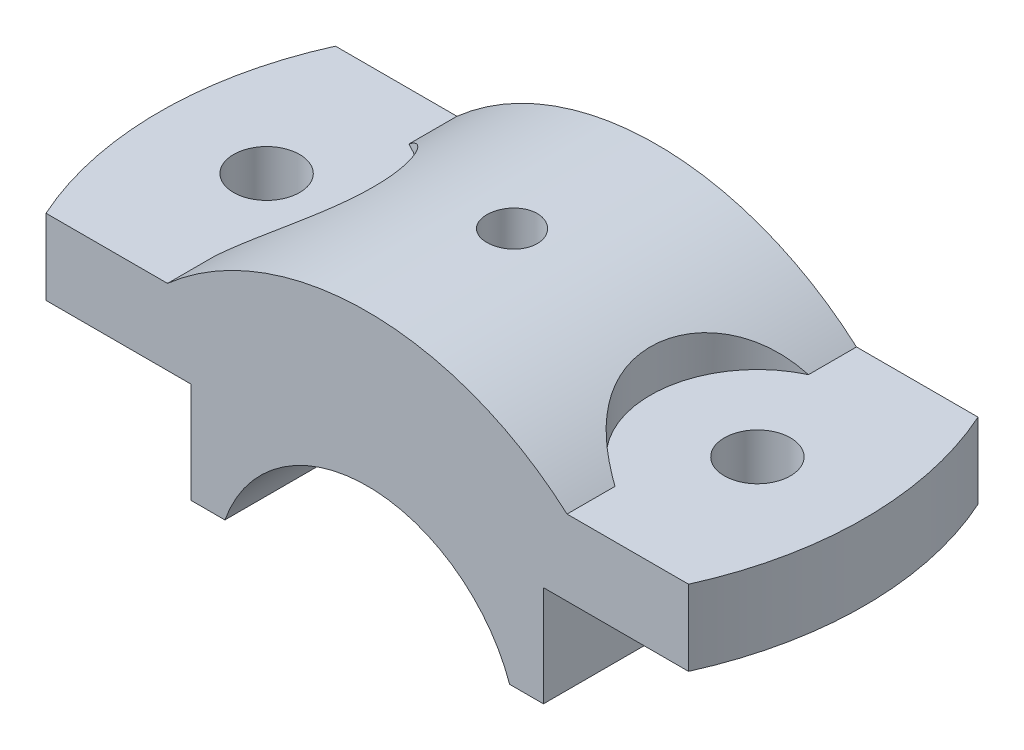
ISO-10303-21;
HEADER;
FILE_DESCRIPTION(('STEP AP214'),'2;1');
FILE_NAME('part.step','',(''),(''),'','','');
FILE_SCHEMA(('AUTOMOTIVE_DESIGN { 1 0 10303 214 1 1 1 1 }'));
ENDSEC;
DATA;
#1=APPLICATION_CONTEXT('core data for automotive mechanical design processes');
#2=APPLICATION_PROTOCOL_DEFINITION('international standard','automotive_design',2000,#1);
#3=PRODUCT_CONTEXT('',#1,'mechanical');
#4=PRODUCT('Part','Part','',(#3));
#5=PRODUCT_RELATED_PRODUCT_CATEGORY('part','',(#4));
#6=PRODUCT_DEFINITION_FORMATION('','',#4);
#7=PRODUCT_DEFINITION_CONTEXT('part definition',#1,'design');
#8=PRODUCT_DEFINITION('design','',#6,#7);
#9=PRODUCT_DEFINITION_SHAPE('','',#8);
#10=(LENGTH_UNIT() NAMED_UNIT(*) SI_UNIT(.MILLI.,.METRE.));
#11=(NAMED_UNIT(*) PLANE_ANGLE_UNIT() SI_UNIT($,.RADIAN.));
#12=(NAMED_UNIT(*) SI_UNIT($,.STERADIAN.) SOLID_ANGLE_UNIT());
#13=UNCERTAINTY_MEASURE_WITH_UNIT(LENGTH_MEASURE(1.E-05),#10,'distance_accuracy_value','');
#14=(GEOMETRIC_REPRESENTATION_CONTEXT(3) GLOBAL_UNCERTAINTY_ASSIGNED_CONTEXT((#13)) GLOBAL_UNIT_ASSIGNED_CONTEXT((#10,
#11,#12)) REPRESENTATION_CONTEXT('',''));
#15=CARTESIAN_POINT('',(0.,0.,0.));
#16=DIRECTION('',(0.,0.,1.));
#17=DIRECTION('',(1.,0.,0.));
#18=AXIS2_PLACEMENT_3D('',#15,#16,#17);
#19=CARTESIAN_POINT('',(0.,-24.,23.));
#20=DIRECTION('',(0.,0.,-1.));
#21=DIRECTION('',(-1.,0.,0.));
#22=AXIS2_PLACEMENT_3D('',#19,#20,#21);
#23=CYLINDRICAL_SURFACE('',#22,48.);
#24=CARTESIAN_POINT('',(0.,24.,-4.));
#25=CARTESIAN_POINT('',(0.224264359684817,23.9999978164606,-3.99999020469488));
#26=CARTESIAN_POINT('',(0.448681388720902,23.9984115417359,-3.98107612075582));
#27=CARTESIAN_POINT('',(0.891306282801559,23.99223609313,-3.90590259257969));
#28=CARTESIAN_POINT('',(1.10950682090092,23.9876435172678,-3.84960083878039));
#29=CARTESIAN_POINT('',(1.53322409005704,23.9759744498441,-3.70129138476253));
#30=CARTESIAN_POINT('',(1.73874792169846,23.9688993639394,-3.60930388756073));
#31=CARTESIAN_POINT('',(2.1313889336643,23.9530587097885,-3.39227027251202));
#32=CARTESIAN_POINT('',(2.31851003954155,23.9442935032543,-3.26723122608997));
#33=CARTESIAN_POINT('',(2.66955999986236,23.9260311946685,-2.98729973357602));
#34=CARTESIAN_POINT('',(2.83343548966464,23.9165324834631,-2.83234046425726));
#35=CARTESIAN_POINT('',(3.13288453414622,23.8978872321267,-2.49710841660027));
#36=CARTESIAN_POINT('',(3.26845684548602,23.8887407074816,-2.31683452678951));
#37=CARTESIAN_POINT('',(3.50763168956092,23.8718181064497,-1.93576753160389));
#38=CARTESIAN_POINT('',(3.61118733180617,23.8640440472037,-1.73494489838891));
#39=CARTESIAN_POINT('',(3.78308973509538,23.8507649779309,-1.31868681777607));
#40=CARTESIAN_POINT('',(3.85143711804967,23.8452599278253,-1.103251628567));
#41=CARTESIAN_POINT('',(3.95082811927428,23.8371556826529,-0.664418432475291));
#42=CARTESIAN_POINT('',(3.9819586615591,23.8345497174488,-0.441040240029593));
#43=CARTESIAN_POINT('',(4.00630083206171,23.832517292859,0.00778481578146177));
#44=CARTESIAN_POINT('',(3.99951317191816,23.8330907738024,0.23323164024401));
#45=CARTESIAN_POINT('',(3.94828345685939,23.8373462944655,0.679198662042084));
#46=CARTESIAN_POINT('',(3.90393587215223,23.8410205351141,0.899729796305649));
#47=CARTESIAN_POINT('',(3.77899194153176,23.8510513427746,1.33020746957181));
#48=CARTESIAN_POINT('',(3.69839524158714,23.857407935984,1.54015390517541));
#49=CARTESIAN_POINT('',(3.50313515260813,23.8720961882741,1.94380362351239));
#50=CARTESIAN_POINT('',(3.38842937902877,23.8804303020385,2.13748631035003));
#51=CARTESIAN_POINT('',(3.12823777565339,23.8981322745552,2.50288535527922));
#52=CARTESIAN_POINT('',(2.98275132249017,23.9075001542413,2.67460126838886));
#53=CARTESIAN_POINT('',(2.66459832890545,23.9262488164658,2.99174167712626));
#54=CARTESIAN_POINT('',(2.4918501175623,23.9356295510026,3.13708425651701));
#55=CARTESIAN_POINT('',(2.124362225487,23.9533196747934,3.39671889355421));
#56=CARTESIAN_POINT('',(1.92962253006135,23.9616290633314,3.51101093045423));
#57=CARTESIAN_POINT('',(1.52362637307141,23.9762418323856,3.70529505067482));
#58=CARTESIAN_POINT('',(1.3123681672363,23.9825450006977,3.78528350591262));
#59=CARTESIAN_POINT('',(0.879356276078329,23.9924326964719,3.90863252980531));
#60=CARTESIAN_POINT('',(0.657602808675422,23.9960172803554,3.95199385862105));
#61=CARTESIAN_POINT('',(0.210605200657006,24.000056677722,4.00075505616631));
#62=CARTESIAN_POINT('',(-0.0146265164607818,24.0005208196801,4.00626807242759));
#63=CARTESIAN_POINT('',(-0.462811010013211,23.998291951148,3.97947255749074));
#64=CARTESIAN_POINT('',(-0.685763807685651,23.995598970107,3.94716437908216));
#65=CARTESIAN_POINT('',(-1.1227390248988,23.9873647136528,3.84573736555962));
#66=CARTESIAN_POINT('',(-1.33677370055889,23.9818274966968,3.77667097589676));
#67=CARTESIAN_POINT('',(-1.75021666032995,23.968526804494,3.60374164887189));
#68=CARTESIAN_POINT('',(-1.94962471313253,23.9607632940497,3.499878161366));
#69=CARTESIAN_POINT('',(-2.32866887320763,23.9438570557453,3.26001860313458));
#70=CARTESIAN_POINT('',(-2.50825740208588,23.9347111287495,3.12394757442069));
#71=CARTESIAN_POINT('',(-2.84208437937448,23.9160783455879,2.82364377179807));
#72=CARTESIAN_POINT('',(-2.99632238725753,23.9065914835011,2.65941050860293));
#73=CARTESIAN_POINT('',(-3.27545818182041,23.8883184486329,2.30695323120664));
#74=CARTESIAN_POINT('',(-3.40028213293455,23.8795340749689,2.1186706352104));
#75=CARTESIAN_POINT('',(-3.61654025135807,23.8636860697728,1.72375094854634));
#76=CARTESIAN_POINT('',(-3.70797475203985,23.8566224210606,1.51711404116025));
#77=CARTESIAN_POINT('',(-3.85473270976226,23.8450257139576,1.09161283784305));
#78=CARTESIAN_POINT('',(-3.91010136579716,23.8404894891454,0.87276422114268));
#79=CARTESIAN_POINT('',(-3.98330307964061,23.834450627634,0.428837200502306));
#80=CARTESIAN_POINT('',(-4.00113685827306,23.8329479326787,0.203758916281624));
#81=CARTESIAN_POINT('',(-3.99875425156372,23.8331471180078,-0.24550450408358));
#82=CARTESIAN_POINT('',(-3.97865387910956,23.8348392277228,-0.469690268945749));
#83=CARTESIAN_POINT('',(-3.90121545318012,23.8412166032923,-0.911490134203402));
#84=CARTESIAN_POINT('',(-3.84387734291051,23.8459018737118,-1.12910422457536));
#85=CARTESIAN_POINT('',(-3.69362044006825,23.8577350852682,-1.55159105306647));
#86=CARTESIAN_POINT('',(-3.60070373602613,23.8648828818476,-1.75646453826275));
#87=CARTESIAN_POINT('',(-3.381940235789,23.8808359950028,-2.14772336229467));
#88=CARTESIAN_POINT('',(-3.25609395645823,23.8896412855619,-2.3341089912533));
#89=CARTESIAN_POINT('',(-2.97460776848979,23.9079492679473,-2.68369495605204));
#90=CARTESIAN_POINT('',(-2.81888197496584,23.9174539202297,-2.84682603462939));
#91=CARTESIAN_POINT('',(-2.48221290236986,23.9360718003871,-3.14470074081327));
#92=CARTESIAN_POINT('',(-2.30126353056437,23.945184932993,-3.27943748998406));
#93=CARTESIAN_POINT('',(-1.91893509211766,23.962009393691,-3.51687944167025));
#94=CARTESIAN_POINT('',(-1.71751862508215,23.9697180809242,-3.61952455462531));
#95=CARTESIAN_POINT('',(-1.30038300798293,23.982834100652,-3.78940721220511));
#96=CARTESIAN_POINT('',(-1.0846806216546,23.9882440771303,-3.85668545715242));
#97=CARTESIAN_POINT('',(-0.723088192386718,23.994764309354,-3.93679033000819));
#98=CARTESIAN_POINT('',(-0.579523577753883,23.9967187550781,-3.96046245006995));
#99=CARTESIAN_POINT('',(-0.29066068600465,23.9993373063453,-3.99207043870882));
#100=CARTESIAN_POINT('',(-0.14536241349218,24.0000014153143,-4.00000634906587));
#101=CARTESIAN_POINT('',(0.,24.,-4.));
#102=B_SPLINE_CURVE_WITH_KNOTS('',3,(#24,#25,#26,#27,#28,#29,#30,#31,#32,#33,#34,#35,#36,#37,
#38,#39,#40,#41,#42,#43,#44,#45,#46,#47,#48,#49,#50,#51,#52,#53,#54,#55,#56,#57,#58,#59,#60,#61,
#62,#63,#64,#65,#66,#67,#68,#69,#70,#71,#72,#73,#74,#75,#76,#77,#78,#79,#80,#81,#82,#83,#84,#85,
#86,#87,#88,#89,#90,#91,#92,#93,#94,#95,#96,#97,#98,#99,#100,#101),.UNSPECIFIED.,.T.,.F.,(4,2,2,
2,2,2,2,2,2,2,2,2,2,2,2,2,2,2,2,2,2,2,2,2,2,2,2,2,2,2,2,2,2,2,2,2,2,2,4),(0.,0.672262347200556,
1.34528675599134,2.01793069555582,2.69043083833672,3.36445067514306,4.03850011495726,
4.71353211804365,5.38855219711603,6.06199259326345,6.73542035050475,7.40715932441158,
8.07890485907995,8.75148862995597,9.4240860232344,10.098738037406,10.7733905023458,
11.448114303618,12.1228241013014,12.7955159722867,13.4682015685688,14.1399299612314,
14.8116689744549,15.4849869989971,16.15831672285,16.8333190596481,17.5083146567931,
18.1824626896371,18.8565977759503,19.5286745153011,20.2007522796936,20.8727905979009,
21.5448183683942,22.2188075465856,22.8929598092992,23.5683669225021,24.2429950636714,
24.6787394542665,25.1144826879498),.UNSPECIFIED.);
#103=CARTESIAN_POINT('',(0.,24.,-4.));
#104=VERTEX_POINT('',#103);
#105=EDGE_CURVE('E12',#104,#104,#102,.T.);
#106=ORIENTED_EDGE('',*,*,#105,.T.);
#107=EDGE_LOOP('',(#106));
#108=FACE_BOUND('',#107,.T.);
#109=CARTESIAN_POINT('',(31.7490157327751,12.,-15.3760601961769));
#110=CARTESIAN_POINT('',(31.5666993606048,12.1607910344816,-15.2900831270757));
#111=CARTESIAN_POINT('',(31.3842407385664,12.3192382806886,-15.200076432177));
#112=CARTESIAN_POINT('',(31.0194382984914,12.6312986785064,-15.0117552307289));
#113=CARTESIAN_POINT('',(30.83709449581,12.7849112802083,-14.9134397837671));
#114=CARTESIAN_POINT('',(30.2906545114744,13.2384242405059,-14.6055515958542));
#115=CARTESIAN_POINT('',(29.9273932433292,13.5307855559239,-14.3831506648985));
#116=CARTESIAN_POINT('',(29.2055877678829,14.0952057641667,-13.9017498917579));
#117=CARTESIAN_POINT('',(28.8470773519232,14.3671527207169,-13.6425680163447));
#118=CARTESIAN_POINT('',(28.1414563178619,14.8876660950044,-13.0879067788259));
#119=CARTESIAN_POINT('',(27.7943424142725,15.1362392903486,-12.7924379963692));
#120=CARTESIAN_POINT('',(27.1144372728569,15.6103537782901,-12.1634340928703));
#121=CARTESIAN_POINT('',(26.7817440960143,15.8357484531289,-11.8296819039897));
#122=CARTESIAN_POINT('',(26.1381758530123,16.2609560521935,-11.1265718110928));
#123=CARTESIAN_POINT('',(25.8273031949563,16.4607661549158,-10.7572099878546));
#124=CARTESIAN_POINT('',(25.2335249148575,16.8337098769773,-9.98600624775));
#125=CARTESIAN_POINT('',(24.9505424988563,17.0069175240426,-9.58425938846312));
#126=CARTESIAN_POINT('',(24.4165226257608,17.3271148139075,-8.7502719786338));
#127=CARTESIAN_POINT('',(24.165480267083,17.4741084809499,-8.31803612285602));
#128=CARTESIAN_POINT('',(23.7269538102758,17.7263466257883,-7.4787321432782));
#129=CARTESIAN_POINT('',(23.535471816767,17.8344606926746,-7.07460691096142));
#130=CARTESIAN_POINT('',(23.1835604410674,18.0305023424913,-6.24834535649117));
#131=CARTESIAN_POINT('',(23.0231288276401,18.1184313759742,-5.82621033115844));
#132=CARTESIAN_POINT('',(22.7354708993115,18.2744033380662,-4.96694066927119));
#133=CARTESIAN_POINT('',(22.608263014144,18.3424352319097,-4.52979785912656));
#134=CARTESIAN_POINT('',(22.3889311500727,18.4588178093571,-3.64423461983451));
#135=CARTESIAN_POINT('',(22.2968060905276,18.5071690991774,-3.19581453850972));
#136=CARTESIAN_POINT('',(22.1535573681311,18.5819913104556,-2.31986442510464));
#137=CARTESIAN_POINT('',(22.1002179585565,18.6096478774008,-1.8927960452594));
#138=CARTESIAN_POINT('',(22.0260840023336,18.6480173220226,-1.03510100849079));
#139=CARTESIAN_POINT('',(22.0052877863416,18.6587310688026,-0.6044745352235));
#140=CARTESIAN_POINT('',(21.9964874817101,18.6632694542849,0.25703375198857));
#141=CARTESIAN_POINT('',(22.0084707600267,18.6571005994522,0.68791540359773));
#142=CARTESIAN_POINT('',(22.065059537599,18.6278566152432,1.5469567479689));
#143=CARTESIAN_POINT('',(22.1096651361626,18.6047814344012,1.97511643244078));
#144=CARTESIAN_POINT('',(22.2301596888934,18.5420325739506,2.81994764060092));
#145=CARTESIAN_POINT('',(22.3056259308811,18.5025830752487,3.23669621522389));
#146=CARTESIAN_POINT('',(22.4869158657054,18.4069464217796,4.06157204983066));
#147=CARTESIAN_POINT('',(22.5927390819871,18.3507595297616,4.46969944504494));
#148=CARTESIAN_POINT('',(22.8334963082055,18.2214412118201,5.27452238868222));
#149=CARTESIAN_POINT('',(22.968430619134,18.1483096106976,5.67121781885727));
#150=CARTESIAN_POINT('',(23.2658059297839,17.9848905587104,6.45050946606149));
#151=CARTESIAN_POINT('',(23.4282471429062,17.8946029747475,6.83310557367884));
#152=CARTESIAN_POINT('',(23.7802108235912,17.6958360657888,7.58497168737197));
#153=CARTESIAN_POINT('',(23.9699550727257,17.5872063549857,7.9540980563005));
#154=CARTESIAN_POINT('',(24.3731485080022,17.3521952355227,8.67324372694056));
#155=CARTESIAN_POINT('',(24.5865977528721,17.2258137828835,9.02326298131199));
#156=CARTESIAN_POINT('',(25.0346129932482,16.9552998874379,9.70223622389593));
#157=CARTESIAN_POINT('',(25.2691774101921,16.8111687712936,10.031191783681));
#158=CARTESIAN_POINT('',(25.7566603032743,16.5052741270816,10.6665029899036));
#159=CARTESIAN_POINT('',(26.0095789285025,16.3435104557808,10.9728584527217));
#160=CARTESIAN_POINT('',(26.5418842805158,15.9954208539865,11.574253346598));
#161=CARTESIAN_POINT('',(26.8219376643438,15.8083462352715,11.8682688661706));
#162=CARTESIAN_POINT('',(27.3955194624364,15.4158125971757,12.42968690155));
#163=CARTESIAN_POINT('',(27.6890490642933,15.2103519560056,12.6970870652738));
#164=CARTESIAN_POINT('',(28.2863824379904,14.7816416595243,13.2050051767951));
#165=CARTESIAN_POINT('',(28.5901897214681,14.5583858879776,13.4455138130625));
#166=CARTESIAN_POINT('',(29.2047776474053,14.0950011657592,13.8996257253554));
#167=CARTESIAN_POINT('',(29.515556781803,13.8548758405909,14.113234755093));
#168=CARTESIAN_POINT('',(30.1465409740783,13.3543930550497,14.5175420543304));
#169=CARTESIAN_POINT('',(30.4668164417767,13.0937608790559,14.7077886938376));
#170=CARTESIAN_POINT('',(31.1079315091614,12.5577863535064,15.0615091701432));
#171=CARTESIAN_POINT('',(31.4287665224091,12.282490555825,15.2250617322872));
#172=CARTESIAN_POINT('',(31.7490157327751,12.,15.3760601961769));
#173=B_SPLINE_CURVE_WITH_KNOTS('',3,(#109,#110,#111,#112,#113,#114,#115,#116,#117,#118,#119,
#120,#121,#122,#123,#124,#125,#126,#127,#128,#129,#130,#131,#132,#133,#134,#135,#136,#137,#138,
#139,#140,#141,#142,#143,#144,#145,#146,#147,#148,#149,#150,#151,#152,#153,#154,#155,#156,#157,
#158,#159,#160,#161,#162,#163,#164,#165,#166,#167,#168,#169,#170,#171,#172),.UNSPECIFIED.,.F.,
.F.,(4,2,2,2,2,2,2,2,2,2,2,2,2,2,2,2,2,2,2,2,2,2,2,2,2,2,2,2,2,2,2,4),(0.,0.77345802568237,
1.54700371148749,3.09512332277502,4.65119082007948,6.20680570955183,7.77172305062614,
9.33681282467528,10.8974652129592,12.4578778108564,13.8363264835486,15.2146760660573,
16.5937886249588,17.9728587002062,19.2651269606079,20.5573289303254,21.8490329624022,
23.1407409266611,24.4153187748838,25.6898766154092,26.9644476347566,28.2390285427914,
29.5246179289053,30.8102105000725,32.0957070405173,33.381214024115,34.7209972321288,
36.060898736084,37.4012627703214,38.7413396176214,40.1042161588979,41.4629977344695),.UNSPECIFIED.);
#174=CARTESIAN_POINT('',(31.7490157327751,12.,-15.3760601961769));
#175=VERTEX_POINT('',#174);
#176=CARTESIAN_POINT('',(31.7490157327751,12.,15.3760601961769));
#177=VERTEX_POINT('',#176);
#178=EDGE_CURVE('E57',#175,#177,#173,.T.);
#179=ORIENTED_EDGE('',*,*,#178,.F.);
#180=DIRECTION('',(0.,0.,-1.));
#181=VECTOR('',#180,1.);
#182=CARTESIAN_POINT('',(31.7490157327751,12.,23.));
#183=LINE('',#182,#181);
#184=CARTESIAN_POINT('',(31.7490157327751,12.,-23.));
#185=VERTEX_POINT('',#184);
#186=EDGE_CURVE('E156',#175,#185,#183,.T.);
#187=ORIENTED_EDGE('',*,*,#186,.T.);
#188=CARTESIAN_POINT('',(0.,-24.,-23.));
#189=DIRECTION('',(0.,0.,1.));
#190=DIRECTION('',(1.,0.,0.));
#191=AXIS2_PLACEMENT_3D('',#188,#189,#190);
#192=CIRCLE('',#191,48.);
#193=CARTESIAN_POINT('',(-31.7490157327751,12.,-23.));
#194=VERTEX_POINT('',#193);
#195=EDGE_CURVE('E322',#185,#194,#192,.T.);
#196=ORIENTED_EDGE('',*,*,#195,.T.);
#197=DIRECTION('',(0.,0.,-1.));
#198=VECTOR('',#197,1.);
#199=CARTESIAN_POINT('',(-31.7490157327751,12.,23.));
#200=LINE('',#199,#198);
#201=CARTESIAN_POINT('',(-31.7490157327751,12.,-15.3760601961769));
#202=VERTEX_POINT('',#201);
#203=EDGE_CURVE('E169',#202,#194,#200,.T.);
#204=ORIENTED_EDGE('',*,*,#203,.F.);
#205=CARTESIAN_POINT('',(-31.7490157327751,12.,15.3760601961769));
#206=CARTESIAN_POINT('',(-31.5666993606048,12.1607910344816,15.2900831270757));
#207=CARTESIAN_POINT('',(-31.3842407385664,12.3192382806886,15.200076432177));
#208=CARTESIAN_POINT('',(-31.0194382984914,12.6312986785064,15.0117552307289));
#209=CARTESIAN_POINT('',(-30.83709449581,12.7849112802083,14.9134397837671));
#210=CARTESIAN_POINT('',(-30.2906545114744,13.2384242405059,14.6055515958542));
#211=CARTESIAN_POINT('',(-29.9273932433292,13.5307855559239,14.3831506648985));
#212=CARTESIAN_POINT('',(-29.2055877678829,14.0952057641667,13.9017498917579));
#213=CARTESIAN_POINT('',(-28.8470773519232,14.3671527207169,13.6425680163447));
#214=CARTESIAN_POINT('',(-28.1414563178619,14.8876660950044,13.087906778826));
#215=CARTESIAN_POINT('',(-27.7943424142725,15.1362392903486,12.7924379963692));
#216=CARTESIAN_POINT('',(-27.1144372728569,15.6103537782901,12.1634340928703));
#217=CARTESIAN_POINT('',(-26.7817440960143,15.8357484531289,11.8296819039897));
#218=CARTESIAN_POINT('',(-26.1381758530123,16.2609560521935,11.1265718110928));
#219=CARTESIAN_POINT('',(-25.8273031949563,16.4607661549158,10.7572099878546));
#220=CARTESIAN_POINT('',(-25.2335249148575,16.8337098769773,9.98600624775));
#221=CARTESIAN_POINT('',(-24.9505424988563,17.0069175240426,9.58425938846312));
#222=CARTESIAN_POINT('',(-24.4165226257608,17.3271148139075,8.7502719786338));
#223=CARTESIAN_POINT('',(-24.165480267083,17.4741084809499,8.31803612285601));
#224=CARTESIAN_POINT('',(-23.7269538102758,17.7263466257883,7.4787321432782));
#225=CARTESIAN_POINT('',(-23.535471816767,17.8344606926746,7.07460691096142));
#226=CARTESIAN_POINT('',(-23.1835604410674,18.0305023424913,6.24834535649116));
#227=CARTESIAN_POINT('',(-23.02312882764,18.1184313759742,5.82621033115843));
#228=CARTESIAN_POINT('',(-22.7354708993115,18.2744033380662,4.96694066927118));
#229=CARTESIAN_POINT('',(-22.608263014144,18.3424352319097,4.52979785912655));
#230=CARTESIAN_POINT('',(-22.3889311500727,18.4588178093571,3.6442346198345));
#231=CARTESIAN_POINT('',(-22.2968060905276,18.5071690991774,3.19581453850971));
#232=CARTESIAN_POINT('',(-22.1535573681311,18.5819913104556,2.31986442510463));
#233=CARTESIAN_POINT('',(-22.1002179585565,18.6096478774008,1.89279604525939));
#234=CARTESIAN_POINT('',(-22.0260840023336,18.6480173220226,1.03510100849079));
#235=CARTESIAN_POINT('',(-22.0052877863416,18.6587310688026,0.604474535223495));
#236=CARTESIAN_POINT('',(-21.9964874817101,18.6632694542849,-0.257033751988574));
#237=CARTESIAN_POINT('',(-22.0084707600267,18.6571005994522,-0.687915403597735));
#238=CARTESIAN_POINT('',(-22.065059537599,18.6278566152432,-1.54695674796891));
#239=CARTESIAN_POINT('',(-22.1096651361626,18.6047814344012,-1.97511643244079));
#240=CARTESIAN_POINT('',(-22.2301596888934,18.5420325739506,-2.81994764060092));
#241=CARTESIAN_POINT('',(-22.3056259308811,18.5025830752487,-3.2366962152239));
#242=CARTESIAN_POINT('',(-22.4869158657054,18.4069464217796,-4.06157204983067));
#243=CARTESIAN_POINT('',(-22.5927390819871,18.3507595297616,-4.46969944504494));
#244=CARTESIAN_POINT('',(-22.8334963082055,18.2214412118201,-5.27452238868223));
#245=CARTESIAN_POINT('',(-22.968430619134,18.1483096106976,-5.67121781885727));
#246=CARTESIAN_POINT('',(-23.2658059297839,17.9848905587104,-6.45050946606149));
#247=CARTESIAN_POINT('',(-23.4282471429062,17.8946029747475,-6.83310557367884));
#248=CARTESIAN_POINT('',(-23.7802108235912,17.6958360657888,-7.58497168737197));
#249=CARTESIAN_POINT('',(-23.9699550727257,17.5872063549857,-7.9540980563005));
#250=CARTESIAN_POINT('',(-24.3731485080022,17.3521952355227,-8.67324372694056));
#251=CARTESIAN_POINT('',(-24.5865977528721,17.2258137828835,-9.02326298131199));
#252=CARTESIAN_POINT('',(-25.0346129932482,16.9552998874379,-9.70223622389594));
#253=CARTESIAN_POINT('',(-25.2691774101921,16.8111687712936,-10.031191783681));
#254=CARTESIAN_POINT('',(-25.7566603032743,16.5052741270816,-10.6665029899036));
#255=CARTESIAN_POINT('',(-26.0095789285025,16.3435104557808,-10.9728584527218));
#256=CARTESIAN_POINT('',(-26.5418842805158,15.9954208539865,-11.574253346598));
#257=CARTESIAN_POINT('',(-26.8219376643438,15.8083462352715,-11.8682688661706));
#258=CARTESIAN_POINT('',(-27.3955194624364,15.4158125971757,-12.42968690155));
#259=CARTESIAN_POINT('',(-27.6890490642933,15.2103519560056,-12.6970870652738));
#260=CARTESIAN_POINT('',(-28.2863824379904,14.7816416595243,-13.2050051767951));
#261=CARTESIAN_POINT('',(-28.5901897214681,14.5583858879776,-13.4455138130625));
#262=CARTESIAN_POINT('',(-29.2047776474053,14.0950011657592,-13.8996257253554));
#263=CARTESIAN_POINT('',(-29.515556781803,13.8548758405909,-14.113234755093));
#264=CARTESIAN_POINT('',(-30.1465409740783,13.3543930550497,-14.5175420543304));
#265=CARTESIAN_POINT('',(-30.4668164417767,13.0937608790559,-14.7077886938376));
#266=CARTESIAN_POINT('',(-31.1079315091614,12.5577863535064,-15.0615091701432));
#267=CARTESIAN_POINT('',(-31.4287665224091,12.282490555825,-15.2250617322872));
#268=CARTESIAN_POINT('',(-31.7490157327751,12.,-15.3760601961769));
#269=B_SPLINE_CURVE_WITH_KNOTS('',3,(#205,#206,#207,#208,#209,#210,#211,#212,#213,#214,#215,
#216,#217,#218,#219,#220,#221,#222,#223,#224,#225,#226,#227,#228,#229,#230,#231,#232,#233,#234,
#235,#236,#237,#238,#239,#240,#241,#242,#243,#244,#245,#246,#247,#248,#249,#250,#251,#252,#253,
#254,#255,#256,#257,#258,#259,#260,#261,#262,#263,#264,#265,#266,#267,#268),.UNSPECIFIED.,.F.,
.F.,(4,2,2,2,2,2,2,2,2,2,2,2,2,2,2,2,2,2,2,2,2,2,2,2,2,2,2,2,2,2,2,4),(0.,0.773458025682373,
1.5470037114875,3.09512332277503,4.65119082007948,6.20680570955184,7.77172305062615,
9.33681282467528,10.8974652129592,12.4578778108564,13.8363264835486,15.2146760660573,
16.5937886249588,17.9728587002062,19.2651269606079,20.5573289303254,21.8490329624022,
23.1407409266611,24.4153187748838,25.6898766154092,26.9644476347566,28.2390285427914,
29.5246179289053,30.8102105000725,32.0957070405173,33.381214024115,34.7209972321288,
36.060898736084,37.4012627703214,38.7413396176214,40.1042161588979,41.4629977344695),.UNSPECIFIED.);
#270=CARTESIAN_POINT('',(-31.7490157327751,12.,15.3760601961769));
#271=VERTEX_POINT('',#270);
#272=EDGE_CURVE('E160',#271,#202,#269,.T.);
#273=ORIENTED_EDGE('',*,*,#272,.F.);
#274=CARTESIAN_POINT('',(-31.7490157327751,12.,23.));
#275=VERTEX_POINT('',#274);
#276=EDGE_CURVE('E166',#275,#271,#200,.T.);
#277=ORIENTED_EDGE('',*,*,#276,.F.);
#278=CARTESIAN_POINT('',(0.,-24.,23.));
#279=DIRECTION('',(0.,0.,1.));
#280=DIRECTION('',(1.,0.,0.));
#281=AXIS2_PLACEMENT_3D('',#278,#279,#280);
#282=CIRCLE('',#281,48.);
#283=CARTESIAN_POINT('',(31.7490157327751,12.,23.));
#284=VERTEX_POINT('',#283);
#285=EDGE_CURVE('E296',#284,#275,#282,.T.);
#286=ORIENTED_EDGE('',*,*,#285,.F.);
#287=EDGE_CURVE('E159',#284,#177,#183,.T.);
#288=ORIENTED_EDGE('',*,*,#287,.T.);
#289=EDGE_LOOP('',(#179,#187,#196,#204,#273,#277,#286,#288));
#290=FACE_BOUND('',#289,.T.);
#291=ADVANCED_FACE('F44',(#108,#290),#23,.T.);
#292=CARTESIAN_POINT('',(28.,0.,23.));
#293=DIRECTION('',(0.,1.,0.));
#294=DIRECTION('',(0.,0.,1.));
#295=AXIS2_PLACEMENT_3D('',#292,#293,#294);
#296=PLANE('',#295);
#297=CARTESIAN_POINT('',(39.,0.,0.));
#298=DIRECTION('',(0.,1.,0.));
#299=DIRECTION('',(0.,0.,1.));
#300=AXIS2_PLACEMENT_3D('',#297,#298,#299);
#301=CIRCLE('',#300,5.25);
#302=CARTESIAN_POINT('',(39.,0.,5.25));
#303=VERTEX_POINT('',#302);
#304=EDGE_CURVE('E274',#303,#303,#301,.T.);
#305=ORIENTED_EDGE('',*,*,#304,.T.);
#306=EDGE_LOOP('',(#305));
#307=FACE_BOUND('',#306,.T.);
#308=CARTESIAN_POINT('',(0.,0.,0.));
#309=DIRECTION('',(0.,1.,0.));
#310=DIRECTION('',(0.,0.,1.));
#311=AXIS2_PLACEMENT_3D('',#308,#309,#310);
#312=CIRCLE('',#311,56.);
#313=CARTESIAN_POINT('',(51.058789644879,0.,23.));
#314=VERTEX_POINT('',#313);
#315=CARTESIAN_POINT('',(51.058789644879,0.,-23.));
#316=VERTEX_POINT('',#315);
#317=EDGE_CURVE('E278',#314,#316,#312,.T.);
#318=ORIENTED_EDGE('',*,*,#317,.F.);
#319=DIRECTION('',(1.,0.,0.));
#320=VECTOR('',#319,1.);
#321=CARTESIAN_POINT('',(28.,0.,23.));
#322=LINE('',#321,#320);
#323=CARTESIAN_POINT('',(28.,0.,23.));
#324=VERTEX_POINT('',#323);
#325=EDGE_CURVE('E281',#324,#314,#322,.T.);
#326=ORIENTED_EDGE('',*,*,#325,.F.);
#327=DIRECTION('',(0.,0.,-1.));
#328=VECTOR('',#327,1.);
#329=CARTESIAN_POINT('',(28.,0.,23.));
#330=LINE('',#329,#328);
#331=CARTESIAN_POINT('',(28.,0.,-23.));
#332=VERTEX_POINT('',#331);
#333=EDGE_CURVE('E319',#324,#332,#330,.T.);
#334=ORIENTED_EDGE('',*,*,#333,.T.);
#335=DIRECTION('',(1.,0.,0.));
#336=VECTOR('',#335,1.);
#337=CARTESIAN_POINT('',(28.,0.,-23.));
#338=LINE('',#337,#336);
#339=EDGE_CURVE('E283',#332,#316,#338,.T.);
#340=ORIENTED_EDGE('',*,*,#339,.T.);
#341=EDGE_LOOP('',(#318,#326,#334,#340));
#342=FACE_BOUND('',#341,.T.);
#343=ADVANCED_FACE('F46',(#307,#342),#296,.F.);
#344=CARTESIAN_POINT('',(56.,12.,23.));
#345=DIRECTION('',(0.,-1.,0.));
#346=DIRECTION('',(1.,0.,0.));
#347=AXIS2_PLACEMENT_3D('',#344,#345,#346);
#348=PLANE('',#347);
#349=CARTESIAN_POINT('',(39.,12.,0.));
#350=DIRECTION('',(0.,1.,0.));
#351=DIRECTION('',(0.,0.,1.));
#352=AXIS2_PLACEMENT_3D('',#349,#350,#351);
#353=CIRCLE('',#352,5.25);
#354=CARTESIAN_POINT('',(39.,12.,5.25));
#355=VERTEX_POINT('',#354);
#356=EDGE_CURVE('E371',#355,#355,#353,.T.);
#357=ORIENTED_EDGE('',*,*,#356,.F.);
#358=EDGE_LOOP('',(#357));
#359=FACE_BOUND('',#358,.T.);
#360=CARTESIAN_POINT('',(0.,12.,0.));
#361=DIRECTION('',(0.,1.,0.));
#362=DIRECTION('',(-1.,0.,0.));
#363=AXIS2_PLACEMENT_3D('',#360,#361,#362);
#364=CIRCLE('',#363,56.);
#365=CARTESIAN_POINT('',(51.058789644879,12.,23.));
#366=VERTEX_POINT('',#365);
#367=CARTESIAN_POINT('',(51.058789644879,12.,-23.));
#368=VERTEX_POINT('',#367);
#369=EDGE_CURVE('E152',#366,#368,#364,.T.);
#370=ORIENTED_EDGE('',*,*,#369,.T.);
#371=DIRECTION('',(-1.,0.,0.));
#372=VECTOR('',#371,1.);
#373=CARTESIAN_POINT('',(56.,12.,-23.));
#374=LINE('',#373,#372);
#375=EDGE_CURVE('E164',#368,#185,#374,.T.);
#376=ORIENTED_EDGE('',*,*,#375,.T.);
#377=ORIENTED_EDGE('',*,*,#186,.F.);
#378=CARTESIAN_POINT('',(39.,12.,0.));
#379=DIRECTION('',(0.,1.,0.));
#380=DIRECTION('',(-1.,0.,0.));
#381=AXIS2_PLACEMENT_3D('',#378,#379,#380);
#382=CIRCLE('',#381,17.);
#383=EDGE_CURVE('E64',#175,#177,#382,.T.);
#384=ORIENTED_EDGE('',*,*,#383,.T.);
#385=ORIENTED_EDGE('',*,*,#287,.F.);
#386=DIRECTION('',(-1.,0.,0.));
#387=VECTOR('',#386,1.);
#388=CARTESIAN_POINT('',(56.,12.,23.));
#389=LINE('',#388,#387);
#390=EDGE_CURVE('E293',#366,#284,#389,.T.);
#391=ORIENTED_EDGE('',*,*,#390,.F.);
#392=EDGE_LOOP('',(#370,#376,#377,#384,#385,#391));
#393=FACE_BOUND('',#392,.T.);
#394=ADVANCED_FACE('F162',(#359,#393),#348,.F.);
#395=CARTESIAN_POINT('',(-31.7490157327751,12.,23.));
#396=DIRECTION('',(0.,-1.,0.));
#397=DIRECTION('',(1.,0.,0.));
#398=AXIS2_PLACEMENT_3D('',#395,#396,#397);
#399=PLANE('',#398);
#400=CARTESIAN_POINT('',(-39.,12.,0.));
#401=DIRECTION('',(0.,1.,0.));
#402=DIRECTION('',(0.,0.,1.));
#403=AXIS2_PLACEMENT_3D('',#400,#401,#402);
#404=CIRCLE('',#403,5.25);
#405=CARTESIAN_POINT('',(-39.,12.,5.25));
#406=VERTEX_POINT('',#405);
#407=EDGE_CURVE('E232',#406,#406,#404,.T.);
#408=ORIENTED_EDGE('',*,*,#407,.F.);
#409=EDGE_LOOP('',(#408));
#410=FACE_BOUND('',#409,.T.);
#411=ORIENTED_EDGE('',*,*,#276,.T.);
#412=CARTESIAN_POINT('',(-39.,12.,0.));
#413=DIRECTION('',(0.,1.,0.));
#414=DIRECTION('',(1.,0.,0.));
#415=AXIS2_PLACEMENT_3D('',#412,#413,#414);
#416=CIRCLE('',#415,17.);
#417=EDGE_CURVE('E72',#271,#202,#416,.T.);
#418=ORIENTED_EDGE('',*,*,#417,.T.);
#419=ORIENTED_EDGE('',*,*,#203,.T.);
#420=DIRECTION('',(-1.,0.,0.));
#421=VECTOR('',#420,1.);
#422=CARTESIAN_POINT('',(-31.7490157327751,12.,-23.));
#423=LINE('',#422,#421);
#424=CARTESIAN_POINT('',(-51.058789644879,12.,-23.));
#425=VERTEX_POINT('',#424);
#426=EDGE_CURVE('E324',#194,#425,#423,.T.);
#427=ORIENTED_EDGE('',*,*,#426,.T.);
#428=CARTESIAN_POINT('',(-51.058789644879,12.,23.));
#429=VERTEX_POINT('',#428);
#430=EDGE_CURVE('E363',#425,#429,#364,.T.);
#431=ORIENTED_EDGE('',*,*,#430,.T.);
#432=DIRECTION('',(-1.,0.,0.));
#433=VECTOR('',#432,1.);
#434=CARTESIAN_POINT('',(-31.7490157327751,12.,23.));
#435=LINE('',#434,#433);
#436=EDGE_CURVE('E305',#275,#429,#435,.T.);
#437=ORIENTED_EDGE('',*,*,#436,.F.);
#438=EDGE_LOOP('',(#411,#418,#419,#427,#431,#437));
#439=FACE_BOUND('',#438,.T.);
#440=ADVANCED_FACE('F269',(#410,#439),#399,.F.);
#441=CARTESIAN_POINT('',(-56.,0.,23.));
#442=DIRECTION('',(0.,1.,0.));
#443=DIRECTION('',(0.,0.,1.));
#444=AXIS2_PLACEMENT_3D('',#441,#442,#443);
#445=PLANE('',#444);
#446=CARTESIAN_POINT('',(-39.,0.,0.));
#447=DIRECTION('',(0.,1.,0.));
#448=DIRECTION('',(0.,0.,1.));
#449=AXIS2_PLACEMENT_3D('',#446,#447,#448);
#450=CIRCLE('',#449,5.25);
#451=CARTESIAN_POINT('',(-39.,0.,5.25));
#452=VERTEX_POINT('',#451);
#453=EDGE_CURVE('E375',#452,#452,#450,.T.);
#454=ORIENTED_EDGE('',*,*,#453,.T.);
#455=EDGE_LOOP('',(#454));
#456=FACE_BOUND('',#455,.T.);
#457=CARTESIAN_POINT('',(0.,0.,0.));
#458=DIRECTION('',(0.,1.,0.));
#459=DIRECTION('',(0.,0.,1.));
#460=AXIS2_PLACEMENT_3D('',#457,#458,#459);
#461=CIRCLE('',#460,56.);
#462=CARTESIAN_POINT('',(-51.058789644879,0.,-23.));
#463=VERTEX_POINT('',#462);
#464=CARTESIAN_POINT('',(-51.058789644879,0.,23.));
#465=VERTEX_POINT('',#464);
#466=EDGE_CURVE('E286',#463,#465,#461,.T.);
#467=ORIENTED_EDGE('',*,*,#466,.F.);
#468=DIRECTION('',(1.,0.,0.));
#469=VECTOR('',#468,1.);
#470=CARTESIAN_POINT('',(-56.,0.,-23.));
#471=LINE('',#470,#469);
#472=CARTESIAN_POINT('',(-28.,0.,-23.));
#473=VERTEX_POINT('',#472);
#474=EDGE_CURVE('E327',#463,#473,#471,.T.);
#475=ORIENTED_EDGE('',*,*,#474,.T.);
#476=DIRECTION('',(0.,0.,-1.));
#477=VECTOR('',#476,1.);
#478=CARTESIAN_POINT('',(-28.,0.,23.));
#479=LINE('',#478,#477);
#480=CARTESIAN_POINT('',(-28.,0.,23.));
#481=VERTEX_POINT('',#480);
#482=EDGE_CURVE('E348',#481,#473,#479,.T.);
#483=ORIENTED_EDGE('',*,*,#482,.F.);
#484=DIRECTION('',(1.,0.,0.));
#485=VECTOR('',#484,1.);
#486=CARTESIAN_POINT('',(-56.,0.,23.));
#487=LINE('',#486,#485);
#488=EDGE_CURVE('E308',#465,#481,#487,.T.);
#489=ORIENTED_EDGE('',*,*,#488,.F.);
#490=EDGE_LOOP('',(#467,#475,#483,#489));
#491=FACE_BOUND('',#490,.T.);
#492=ADVANCED_FACE('F205',(#456,#491),#445,.F.);
#493=CARTESIAN_POINT('',(0.,-24.,23.));
#494=DIRECTION('',(0.,0.,1.));
#495=DIRECTION('',(1.,0.,0.));
#496=AXIS2_PLACEMENT_3D('',#493,#494,#495);
#497=PLANE('',#496);
#498=ORIENTED_EDGE('',*,*,#325,.T.);
#499=DIRECTION('',(0.,1.,0.));
#500=VECTOR('',#499,1.);
#501=CARTESIAN_POINT('',(51.058789644879,-34.,23.));
#502=LINE('',#501,#500);
#503=EDGE_CURVE('E285',#314,#366,#502,.T.);
#504=ORIENTED_EDGE('',*,*,#503,.T.);
#505=ORIENTED_EDGE('',*,*,#390,.T.);
#506=ORIENTED_EDGE('',*,*,#285,.T.);
#507=ORIENTED_EDGE('',*,*,#436,.T.);
#508=DIRECTION('',(0.,1.,0.));
#509=VECTOR('',#508,1.);
#510=CARTESIAN_POINT('',(-51.058789644879,-34.,23.));
#511=LINE('',#510,#509);
#512=EDGE_CURVE('E301',#429,#465,#511,.F.);
#513=ORIENTED_EDGE('',*,*,#512,.T.);
#514=ORIENTED_EDGE('',*,*,#488,.T.);
#515=DIRECTION('',(0.,-1.,0.));
#516=VECTOR('',#515,1.);
#517=CARTESIAN_POINT('',(-28.,0.,23.));
#518=LINE('',#517,#516);
#519=CARTESIAN_POINT('',(-28.,-16.,23.));
#520=VERTEX_POINT('',#519);
#521=EDGE_CURVE('E310',#481,#520,#518,.T.);
#522=ORIENTED_EDGE('',*,*,#521,.T.);
#523=DIRECTION('',(1.,0.,0.));
#524=VECTOR('',#523,1.);
#525=CARTESIAN_POINT('',(-28.,-16.,23.));
#526=LINE('',#525,#524);
#527=CARTESIAN_POINT('',(-22.6274169979695,-16.,23.));
#528=VERTEX_POINT('',#527);
#529=EDGE_CURVE('E312',#520,#528,#526,.T.);
#530=ORIENTED_EDGE('',*,*,#529,.T.);
#531=CARTESIAN_POINT('',(0.,-24.,23.));
#532=DIRECTION('',(0.,0.,-1.));
#533=DIRECTION('',(-1.,0.,0.));
#534=AXIS2_PLACEMENT_3D('',#531,#532,#533);
#535=CIRCLE('',#534,24.);
#536=CARTESIAN_POINT('',(22.6274169979695,-16.,23.));
#537=VERTEX_POINT('',#536);
#538=EDGE_CURVE('E314',#528,#537,#535,.T.);
#539=ORIENTED_EDGE('',*,*,#538,.T.);
#540=DIRECTION('',(1.,0.,0.));
#541=VECTOR('',#540,1.);
#542=CARTESIAN_POINT('',(22.6274169979695,-16.,23.));
#543=LINE('',#542,#541);
#544=CARTESIAN_POINT('',(28.,-16.,23.));
#545=VERTEX_POINT('',#544);
#546=EDGE_CURVE('E316',#537,#545,#543,.T.);
#547=ORIENTED_EDGE('',*,*,#546,.T.);
#548=DIRECTION('',(0.,1.,0.));
#549=VECTOR('',#548,1.);
#550=CARTESIAN_POINT('',(28.,-16.,23.));
#551=LINE('',#550,#549);
#552=EDGE_CURVE('E291',#545,#324,#551,.T.);
#553=ORIENTED_EDGE('',*,*,#552,.T.);
#554=EDGE_LOOP('',(#498,#504,#505,#506,#507,#513,#514,#522,#530,#539,#547,#553));
#555=FACE_BOUND('',#554,.T.);
#556=ADVANCED_FACE('F201',(#555),#497,.T.);
#557=CARTESIAN_POINT('',(0.,-24.,-23.));
#558=DIRECTION('',(0.,0.,1.));
#559=DIRECTION('',(1.,0.,0.));
#560=AXIS2_PLACEMENT_3D('',#557,#558,#559);
#561=PLANE('',#560);
#562=DIRECTION('',(0.,1.,0.));
#563=VECTOR('',#562,1.);
#564=CARTESIAN_POINT('',(51.058789644879,-34.,-23.));
#565=LINE('',#564,#563);
#566=EDGE_CURVE('E174',#316,#368,#565,.T.);
#567=ORIENTED_EDGE('',*,*,#566,.F.);
#568=ORIENTED_EDGE('',*,*,#339,.F.);
#569=DIRECTION('',(0.,1.,0.));
#570=VECTOR('',#569,1.);
#571=CARTESIAN_POINT('',(28.,-16.,-23.));
#572=LINE('',#571,#570);
#573=CARTESIAN_POINT('',(28.,-16.,-23.));
#574=VERTEX_POINT('',#573);
#575=EDGE_CURVE('E294',#574,#332,#572,.T.);
#576=ORIENTED_EDGE('',*,*,#575,.F.);
#577=DIRECTION('',(1.,0.,0.));
#578=VECTOR('',#577,1.);
#579=CARTESIAN_POINT('',(22.6274169979695,-16.,-23.));
#580=LINE('',#579,#578);
#581=CARTESIAN_POINT('',(22.6274169979695,-16.,-23.));
#582=VERTEX_POINT('',#581);
#583=EDGE_CURVE('E298',#582,#574,#580,.T.);
#584=ORIENTED_EDGE('',*,*,#583,.F.);
#585=CARTESIAN_POINT('',(0.,-24.,-23.));
#586=DIRECTION('',(0.,0.,-1.));
#587=DIRECTION('',(-1.,0.,0.));
#588=AXIS2_PLACEMENT_3D('',#585,#586,#587);
#589=CIRCLE('',#588,24.);
#590=CARTESIAN_POINT('',(-22.6274169979695,-16.,-23.));
#591=VERTEX_POINT('',#590);
#592=EDGE_CURVE('E333',#591,#582,#589,.T.);
#593=ORIENTED_EDGE('',*,*,#592,.F.);
#594=DIRECTION('',(1.,0.,0.));
#595=VECTOR('',#594,1.);
#596=CARTESIAN_POINT('',(-28.,-16.,-23.));
#597=LINE('',#596,#595);
#598=CARTESIAN_POINT('',(-28.,-16.,-23.));
#599=VERTEX_POINT('',#598);
#600=EDGE_CURVE('E331',#599,#591,#597,.T.);
#601=ORIENTED_EDGE('',*,*,#600,.F.);
#602=DIRECTION('',(0.,-1.,0.));
#603=VECTOR('',#602,1.);
#604=CARTESIAN_POINT('',(-28.,0.,-23.));
#605=LINE('',#604,#603);
#606=EDGE_CURVE('E329',#473,#599,#605,.T.);
#607=ORIENTED_EDGE('',*,*,#606,.F.);
#608=ORIENTED_EDGE('',*,*,#474,.F.);
#609=DIRECTION('',(0.,1.,0.));
#610=VECTOR('',#609,1.);
#611=CARTESIAN_POINT('',(-51.058789644879,-34.,-23.));
#612=LINE('',#611,#610);
#613=EDGE_CURVE('E168',#425,#463,#612,.F.);
#614=ORIENTED_EDGE('',*,*,#613,.F.);
#615=ORIENTED_EDGE('',*,*,#426,.F.);
#616=ORIENTED_EDGE('',*,*,#195,.F.);
#617=ORIENTED_EDGE('',*,*,#375,.F.);
#618=EDGE_LOOP('',(#567,#568,#576,#584,#593,#601,#607,#608,#614,#615,#616,#617));
#619=FACE_BOUND('',#618,.T.);
#620=ADVANCED_FACE('F204',(#619),#561,.F.);
#621=CARTESIAN_POINT('',(-28.,0.,23.));
#622=DIRECTION('',(1.,0.,0.));
#623=DIRECTION('',(0.,1.,0.));
#624=AXIS2_PLACEMENT_3D('',#621,#622,#623);
#625=PLANE('',#624);
#626=ORIENTED_EDGE('',*,*,#606,.T.);
#627=DIRECTION('',(0.,0.,-1.));
#628=VECTOR('',#627,1.);
#629=CARTESIAN_POINT('',(-28.,-16.,23.));
#630=LINE('',#629,#628);
#631=EDGE_CURVE('E346',#520,#599,#630,.T.);
#632=ORIENTED_EDGE('',*,*,#631,.F.);
#633=ORIENTED_EDGE('',*,*,#521,.F.);
#634=ORIENTED_EDGE('',*,*,#482,.T.);
#635=EDGE_LOOP('',(#626,#632,#633,#634));
#636=FACE_BOUND('',#635,.T.);
#637=ADVANCED_FACE('F209',(#636),#625,.F.);
#638=CARTESIAN_POINT('',(-28.,-16.,23.));
#639=DIRECTION('',(0.,1.,0.));
#640=DIRECTION('',(0.,0.,1.));
#641=AXIS2_PLACEMENT_3D('',#638,#639,#640);
#642=PLANE('',#641);
#643=ORIENTED_EDGE('',*,*,#600,.T.);
#644=DIRECTION('',(0.,0.,-1.));
#645=VECTOR('',#644,1.);
#646=CARTESIAN_POINT('',(-22.6274169979695,-16.,23.));
#647=LINE('',#646,#645);
#648=EDGE_CURVE('E343',#528,#591,#647,.T.);
#649=ORIENTED_EDGE('',*,*,#648,.F.);
#650=ORIENTED_EDGE('',*,*,#529,.F.);
#651=ORIENTED_EDGE('',*,*,#631,.T.);
#652=EDGE_LOOP('',(#643,#649,#650,#651));
#653=FACE_BOUND('',#652,.T.);
#654=ADVANCED_FACE('F223',(#653),#642,.F.);
#655=CARTESIAN_POINT('',(0.,-24.,23.));
#656=DIRECTION('',(0.,0.,-1.));
#657=DIRECTION('',(-1.,0.,0.));
#658=AXIS2_PLACEMENT_3D('',#655,#656,#657);
#659=CYLINDRICAL_SURFACE('',#658,24.);
#660=CARTESIAN_POINT('',(0.,0.,-3.));
#661=CARTESIAN_POINT('',(-0.167809314666914,-2.34124285846729E-06,-2.99999287087714));
#662=CARTESIAN_POINT('',(-0.335723489163297,-0.00177858534118006,-2.98587254499686));
#663=CARTESIAN_POINT('',(-0.666879362507704,-0.00869351866367855,-2.92976669451505));
#664=CARTESIAN_POINT('',(-0.830115996748494,-0.0138357187028529,-2.88775207449193));
#665=CARTESIAN_POINT('',(-1.14707468977567,-0.0269032674671258,-2.7771148273031));
#666=CARTESIAN_POINT('',(-1.30080307217537,-0.0348267425334925,-2.70851010982817));
#667=CARTESIAN_POINT('',(-1.59453536987164,-0.0525755894628266,-2.54667925923625));
#668=CARTESIAN_POINT('',(-1.73454163386765,-0.0624006349906098,-2.45345734976314));
#669=CARTESIAN_POINT('',(-1.99765538031758,-0.082916144324093,-2.24448966019249));
#670=CARTESIAN_POINT('',(-2.12067643792455,-0.0936106236909998,-2.12863544478451));
#671=CARTESIAN_POINT('',(-2.34558335226899,-0.114627287882999,-1.87792461175603));
#672=CARTESIAN_POINT('',(-2.4474681316707,-0.124949453708781,-1.7430670261041));
#673=CARTESIAN_POINT('',(-2.62753219354073,-0.144092332564982,-1.4576160269212));
#674=CARTESIAN_POINT('',(-2.70563051512929,-0.152907873865069,-1.30697116611847));
#675=CARTESIAN_POINT('',(-2.83538769189014,-0.167986458507812,-0.994575537663166));
#676=CARTESIAN_POINT('',(-2.88704754967826,-0.174249598642374,-0.832825191423581));
#677=CARTESIAN_POINT('',(-2.96219877602972,-0.183475924756637,-0.503706965295879));
#678=CARTESIAN_POINT('',(-2.98583605767804,-0.186456198759063,-0.336372890754965));
#679=CARTESIAN_POINT('',(-3.00472265946868,-0.188831662286498,-8.84838337980619E-05));
#680=CARTESIAN_POINT('',(-2.9999731212029,-0.188226995981904,0.168861783277551));
#681=CARTESIAN_POINT('',(-2.96234068373748,-0.183516535562976,0.502565792698541));
#682=CARTESIAN_POINT('',(-2.92961851558164,-0.179430744476056,0.667337983440318));
#683=CARTESIAN_POINT('',(-2.83722045981846,-0.168249602908458,0.989034025462786));
#684=CARTESIAN_POINT('',(-2.77754402610228,-0.161154191451324,1.14595771765685));
#685=CARTESIAN_POINT('',(-2.63275867189398,-0.144730609624188,1.44800159882602));
#686=CARTESIAN_POINT('',(-2.54757990444916,-0.13539632146267,1.59308796029878));
#687=CARTESIAN_POINT('',(-2.3542577633483,-0.115551462832828,1.8669680332959));
#688=CARTESIAN_POINT('',(-2.24611333929693,-0.105040838572051,1.99576099916842));
#689=CARTESIAN_POINT('',(-2.00903893290454,-0.0839386813149026,2.23433125286729));
#690=CARTESIAN_POINT('',(-1.87997040940801,-0.0733470913573186,2.34397091011918));
#691=CARTESIAN_POINT('',(-1.60518860293671,-0.0533444093297698,2.54005065603666));
#692=CARTESIAN_POINT('',(-1.4594752815819,-0.0439333199819399,2.6264906912064));
#693=CARTESIAN_POINT('',(-1.15543400563618,-0.0273461733770484,2.7737175845567));
#694=CARTESIAN_POINT('',(-0.99710183440526,-0.0201708671815646,2.83449582465747));
#695=CARTESIAN_POINT('',(-0.672369528517267,-0.0088705706392635,2.9285645922279));
#696=CARTESIAN_POINT('',(-0.5059697719568,-0.00474543748956559,2.96185640656446));
#697=CARTESIAN_POINT('',(-0.171015796696196,-2.88430708769474E-05,2.99982890911266));
#698=CARTESIAN_POINT('',(-0.002483388238328,0.000586033711623636,3.00469919083688));
#699=CARTESIAN_POINT('',(0.332995243796996,-0.00172394393484654,2.98619071913286));
#700=CARTESIAN_POINT('',(0.499941501077648,-0.00464872298145034,2.96281256729809));
#701=CARTESIAN_POINT('',(0.826949409265827,-0.0136947749197011,2.88862834947074));
#702=CARTESIAN_POINT('',(0.987031884509647,-0.0198055102335813,2.83791268391684));
#703=CARTESIAN_POINT('',(1.29641958583009,-0.0345393227976347,2.7105870577045));
#704=CARTESIAN_POINT('',(1.44572444575838,-0.0431624853525188,2.63397621781029));
#705=CARTESIAN_POINT('',(1.73016542482491,-0.0620181250786539,2.45657623499105));
#706=CARTESIAN_POINT('',(1.86522451193258,-0.0722586714898947,2.35566445223324));
#707=CARTESIAN_POINT('',(2.11655638755158,-0.0931782920921272,2.13270060295896));
#708=CARTESIAN_POINT('',(2.23282843000423,-0.103857383677225,2.01064769729881));
#709=CARTESIAN_POINT('',(2.44395835058162,-0.124522734448992,1.74803109989143));
#710=CARTESIAN_POINT('',(2.53869055268152,-0.134504703344081,1.60736598442753));
#711=CARTESIAN_POINT('',(2.70318346733221,-0.152575067554223,1.31201010617435));
#712=CARTESIAN_POINT('',(2.77294468047404,-0.160663500827681,1.15731962462818));
#713=CARTESIAN_POINT('',(2.88531189463985,-0.174001795284061,0.838709617022864));
#714=CARTESIAN_POINT('',(2.92798875294853,-0.17925905778254,0.674815403942434));
#715=CARTESIAN_POINT('',(2.98520399264142,-0.186361009110546,0.3421170194632));
#716=CARTESIAN_POINT('',(2.99974368304292,-0.188205856694684,0.173313076849198));
#717=CARTESIAN_POINT('',(3.0002478433018,-0.188269476210542,-0.163162715045615));
#718=CARTESIAN_POINT('',(2.98640975723913,-0.186513302976559,-0.330834297998266));
#719=CARTESIAN_POINT('',(2.93096928581919,-0.179626625553585,-0.661448555214094));
#720=CARTESIAN_POINT('',(2.88936689748692,-0.174496121003026,-0.824391228970555));
#721=CARTESIAN_POINT('',(2.77964048842759,-0.161446610705404,-1.14089634811968));
#722=CARTESIAN_POINT('',(2.71152597716512,-0.153528604886594,-1.29446213402618));
#723=CARTESIAN_POINT('',(2.55072828258037,-0.135794601062173,-1.58801598485798));
#724=CARTESIAN_POINT('',(2.45804479141151,-0.12597857927505,-1.72800387962379));
#725=CARTESIAN_POINT('',(2.25000759751901,-0.105472742973206,-1.99143747040857));
#726=CARTESIAN_POINT('',(2.13450675092995,-0.0947775349916076,-2.11476655314597));
#727=CARTESIAN_POINT('',(1.88442027236206,-0.0737660208852006,-2.34036819020157));
#728=CARTESIAN_POINT('',(1.74983014696988,-0.0634498046929176,-2.44263577292918));
#729=CARTESIAN_POINT('',(1.46479874502505,-0.0443153209590409,-2.62354242852635));
#730=CARTESIAN_POINT('',(1.3142991355154,-0.0355028990603871,-2.70209016707911));
#731=CARTESIAN_POINT('',(1.00221948276154,-0.0204282110793009,-2.83268549149954));
#732=CARTESIAN_POINT('',(0.840651697044284,-0.014163175565103,-2.88476187162415));
#733=CARTESIAN_POINT('',(0.56520692636151,-0.00639935606704893,-2.94847120580557));
#734=CARTESIAN_POINT('',(0.453066796220305,-0.00401128925455763,-2.96776673037848));
#735=CARTESIAN_POINT('',(0.227300475854922,-0.000810824049737661,-2.99353349483187));
#736=CARTESIAN_POINT('',(0.113674296595233,1.58596163522355E-06,-3.00000482927916));
#737=CARTESIAN_POINT('',(0.,0.,-3.));
#738=B_SPLINE_CURVE_WITH_KNOTS('',3,(#660,#661,#662,#663,#664,#665,#666,#667,#668,#669,#670,
#671,#672,#673,#674,#675,#676,#677,#678,#679,#680,#681,#682,#683,#684,#685,#686,#687,#688,#689,
#690,#691,#692,#693,#694,#695,#696,#697,#698,#699,#700,#701,#702,#703,#704,#705,#706,#707,#708,
#709,#710,#711,#712,#713,#714,#715,#716,#717,#718,#719,#720,#721,#722,#723,#724,#725,#726,#727,
#728,#729,#730,#731,#732,#733,#734,#735,#736,#737),.UNSPECIFIED.,.T.,.F.,(4,2,2,2,2,2,2,2,2,2,2,
2,2,2,2,2,2,2,2,2,2,2,2,2,2,2,2,2,2,2,2,2,2,2,2,2,2,2,4),(0.,0.503012727331497,1.00655095313211,
1.50975060981813,2.01286398709288,2.51844975842212,3.02406129360013,3.53137500382644,
4.03866947396168,4.54331070343585,5.04793163861597,5.54967235730031,6.0514232419949,
6.5545611154264,7.05772200616366,7.564361737637,8.07100263735736,8.57781354877926,
9.08460073084536,9.58800335270306,10.0913952540231,10.5931326467208,11.0948870769474,
11.5992288351411,12.1035906165011,12.6108236580909,13.1180465306585,13.6239368913711,
14.1298037161275,14.6321628144266,15.1345219665546,15.6367010964779,16.1388865189472,
16.644422852302,17.1500783816402,17.6576568364422,18.1646819842084,18.5054261182515,
18.8461677396052),.UNSPECIFIED.);
#739=CARTESIAN_POINT('',(0.,0.,-3.));
#740=VERTEX_POINT('',#739);
#741=EDGE_CURVE('E226',#740,#740,#738,.T.);
#742=ORIENTED_EDGE('',*,*,#741,.T.);
#743=EDGE_LOOP('',(#742));
#744=FACE_BOUND('',#743,.T.);
#745=ORIENTED_EDGE('',*,*,#592,.T.);
#746=DIRECTION('',(0.,0.,-1.));
#747=VECTOR('',#746,1.);
#748=CARTESIAN_POINT('',(22.6274169979695,-16.,23.));
#749=LINE('',#748,#747);
#750=EDGE_CURVE('E340',#537,#582,#749,.T.);
#751=ORIENTED_EDGE('',*,*,#750,.F.);
#752=ORIENTED_EDGE('',*,*,#538,.F.);
#753=ORIENTED_EDGE('',*,*,#648,.T.);
#754=EDGE_LOOP('',(#745,#751,#752,#753));
#755=FACE_BOUND('',#754,.T.);
#756=ADVANCED_FACE('F218',(#744,#755),#659,.F.);
#757=CARTESIAN_POINT('',(22.6274169979695,-16.,23.));
#758=DIRECTION('',(0.,1.,0.));
#759=DIRECTION('',(0.,0.,1.));
#760=AXIS2_PLACEMENT_3D('',#757,#758,#759);
#761=PLANE('',#760);
#762=ORIENTED_EDGE('',*,*,#583,.T.);
#763=DIRECTION('',(0.,0.,-1.));
#764=VECTOR('',#763,1.);
#765=CARTESIAN_POINT('',(28.,-16.,23.));
#766=LINE('',#765,#764);
#767=EDGE_CURVE('E337',#545,#574,#766,.T.);
#768=ORIENTED_EDGE('',*,*,#767,.F.);
#769=ORIENTED_EDGE('',*,*,#546,.F.);
#770=ORIENTED_EDGE('',*,*,#750,.T.);
#771=EDGE_LOOP('',(#762,#768,#769,#770));
#772=FACE_BOUND('',#771,.T.);
#773=ADVANCED_FACE('F214',(#772),#761,.F.);
#774=CARTESIAN_POINT('',(28.,-16.,23.));
#775=DIRECTION('',(-1.,0.,0.));
#776=DIRECTION('',(0.,0.,1.));
#777=AXIS2_PLACEMENT_3D('',#774,#775,#776);
#778=PLANE('',#777);
#779=ORIENTED_EDGE('',*,*,#575,.T.);
#780=ORIENTED_EDGE('',*,*,#333,.F.);
#781=ORIENTED_EDGE('',*,*,#552,.F.);
#782=ORIENTED_EDGE('',*,*,#767,.T.);
#783=EDGE_LOOP('',(#779,#780,#781,#782));
#784=FACE_BOUND('',#783,.T.);
#785=ADVANCED_FACE('F211',(#784),#778,.F.);
#786=CARTESIAN_POINT('',(0.,-34.,0.));
#787=DIRECTION('',(0.,1.,0.));
#788=DIRECTION('',(-1.,0.,0.));
#789=AXIS2_PLACEMENT_3D('',#786,#787,#788);
#790=CYLINDRICAL_SURFACE('',#789,56.);
#791=ORIENTED_EDGE('',*,*,#466,.T.);
#792=ORIENTED_EDGE('',*,*,#512,.F.);
#793=ORIENTED_EDGE('',*,*,#430,.F.);
#794=ORIENTED_EDGE('',*,*,#613,.T.);
#795=EDGE_LOOP('',(#791,#792,#793,#794));
#796=FACE_BOUND('',#795,.T.);
#797=ADVANCED_FACE('F199',(#796),#790,.T.);
#798=ORIENTED_EDGE('',*,*,#317,.T.);
#799=ORIENTED_EDGE('',*,*,#566,.T.);
#800=ORIENTED_EDGE('',*,*,#369,.F.);
#801=ORIENTED_EDGE('',*,*,#503,.F.);
#802=EDGE_LOOP('',(#798,#799,#800,#801));
#803=FACE_BOUND('',#802,.T.);
#804=ADVANCED_FACE('F193',(#803),#790,.T.);
#805=CARTESIAN_POINT('',(-39.,58.,0.));
#806=DIRECTION('',(0.,-1.,0.));
#807=DIRECTION('',(1.,0.,0.));
#808=AXIS2_PLACEMENT_3D('',#805,#806,#807);
#809=CYLINDRICAL_SURFACE('',#808,17.);
#810=ORIENTED_EDGE('',*,*,#272,.T.);
#811=ORIENTED_EDGE('',*,*,#417,.F.);
#812=EDGE_LOOP('',(#810,#811));
#813=FACE_BOUND('',#812,.T.);
#814=ADVANCED_FACE('F189',(#813),#809,.F.);
#815=CARTESIAN_POINT('',(39.,58.,0.));
#816=DIRECTION('',(0.,-1.,0.));
#817=DIRECTION('',(1.,0.,0.));
#818=AXIS2_PLACEMENT_3D('',#815,#816,#817);
#819=CYLINDRICAL_SURFACE('',#818,17.);
#820=ORIENTED_EDGE('',*,*,#178,.T.);
#821=ORIENTED_EDGE('',*,*,#383,.F.);
#822=EDGE_LOOP('',(#820,#821));
#823=FACE_BOUND('',#822,.T.);
#824=ADVANCED_FACE('F150',(#823),#819,.F.);
#825=CARTESIAN_POINT('',(39.,12.,0.));
#826=DIRECTION('',(0.,1.,0.));
#827=DIRECTION('',(0.,0.,1.));
#828=AXIS2_PLACEMENT_3D('',#825,#826,#827);
#829=CYLINDRICAL_SURFACE('',#828,5.25);
#830=ORIENTED_EDGE('',*,*,#356,.T.);
#831=EDGE_LOOP('',(#830));
#832=FACE_BOUND('',#831,.T.);
#833=ORIENTED_EDGE('',*,*,#304,.F.);
#834=EDGE_LOOP('',(#833));
#835=FACE_BOUND('',#834,.T.);
#836=ADVANCED_FACE('F249',(#832,#835),#829,.F.);
#837=CARTESIAN_POINT('',(-39.,12.,0.));
#838=DIRECTION('',(0.,1.,0.));
#839=DIRECTION('',(0.,0.,1.));
#840=AXIS2_PLACEMENT_3D('',#837,#838,#839);
#841=CYLINDRICAL_SURFACE('',#840,5.25);
#842=ORIENTED_EDGE('',*,*,#407,.T.);
#843=EDGE_LOOP('',(#842));
#844=FACE_BOUND('',#843,.T.);
#845=ORIENTED_EDGE('',*,*,#453,.F.);
#846=EDGE_LOOP('',(#845));
#847=FACE_BOUND('',#846,.T.);
#848=ADVANCED_FACE('F246',(#844,#847),#841,.F.);
#849=CARTESIAN_POINT('',(0.,0.,0.));
#850=DIRECTION('',(0.,-1.,0.));
#851=DIRECTION('',(0.,0.,-1.));
#852=AXIS2_PLACEMENT_3D('',#849,#850,#851);
#853=CYLINDRICAL_SURFACE('',#852,4.);
#854=CARTESIAN_POINT('',(0.,8.,0.));
#855=DIRECTION('',(0.,-1.,0.));
#856=DIRECTION('',(0.,0.,-1.));
#857=AXIS2_PLACEMENT_3D('',#854,#855,#856);
#858=CIRCLE('',#857,4.);
#859=CARTESIAN_POINT('',(0.,8.,-4.));
#860=VERTEX_POINT('',#859);
#861=EDGE_CURVE('E233',#860,#860,#858,.T.);
#862=ORIENTED_EDGE('',*,*,#861,.T.);
#863=EDGE_LOOP('',(#862));
#864=FACE_BOUND('',#863,.T.);
#865=ORIENTED_EDGE('',*,*,#105,.F.);
#866=EDGE_LOOP('',(#865));
#867=FACE_BOUND('',#866,.T.);
#868=ADVANCED_FACE('F239',(#864,#867),#853,.F.);
#869=CARTESIAN_POINT('',(0.,0.,0.));
#870=DIRECTION('',(0.,-1.,0.));
#871=DIRECTION('',(0.,0.,-1.));
#872=AXIS2_PLACEMENT_3D('',#869,#870,#871);
#873=CYLINDRICAL_SURFACE('',#872,3.);
#874=CARTESIAN_POINT('',(0.,8.,0.));
#875=DIRECTION('',(0.,-1.,0.));
#876=DIRECTION('',(0.,0.,-1.));
#877=AXIS2_PLACEMENT_3D('',#874,#875,#876);
#878=CIRCLE('',#877,3.);
#879=CARTESIAN_POINT('',(0.,8.,-3.));
#880=VERTEX_POINT('',#879);
#881=EDGE_CURVE('E382',#880,#880,#878,.T.);
#882=ORIENTED_EDGE('',*,*,#881,.F.);
#883=EDGE_LOOP('',(#882));
#884=FACE_BOUND('',#883,.T.);
#885=ORIENTED_EDGE('',*,*,#741,.F.);
#886=EDGE_LOOP('',(#885));
#887=FACE_BOUND('',#886,.T.);
#888=ADVANCED_FACE('F234',(#884,#887),#873,.F.);
#889=CARTESIAN_POINT('',(4.,8.,0.));
#890=DIRECTION('',(0.,-1.,0.));
#891=DIRECTION('',(0.,0.,-1.));
#892=AXIS2_PLACEMENT_3D('',#889,#890,#891);
#893=PLANE('',#892);
#894=ORIENTED_EDGE('',*,*,#861,.F.);
#895=EDGE_LOOP('',(#894));
#896=FACE_BOUND('',#895,.T.);
#897=ORIENTED_EDGE('',*,*,#881,.T.);
#898=EDGE_LOOP('',(#897));
#899=FACE_BOUND('',#898,.T.);
#900=ADVANCED_FACE('F238',(#896,#899),#893,.F.);
#901=CLOSED_SHELL('',(#291,#343,#394,#440,#492,#556,#620,#637,#654,#756,#773,#785,#797,#804,
#814,#824,#836,#848,#868,#888,#900));
#902=MANIFOLD_SOLID_BREP('B2',#901);
#903=ADVANCED_BREP_SHAPE_REPRESENTATION('',(#18,#902),#14);
#904=SHAPE_DEFINITION_REPRESENTATION(#9,#903);
ENDSEC;
END-ISO-10303-21;
